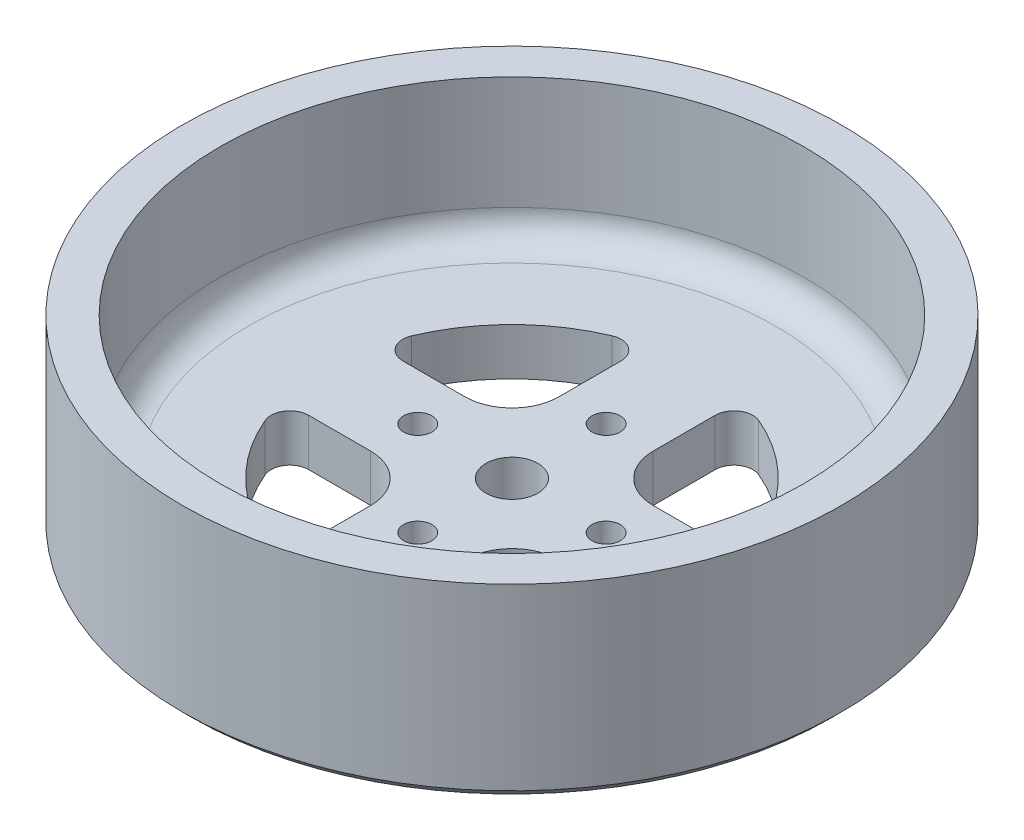
ISO-10303-21;
HEADER;
FILE_DESCRIPTION(('STEP AP214'),'2;1');
FILE_NAME('part.step','',(''),(''),'','','');
FILE_SCHEMA(('AUTOMOTIVE_DESIGN { 1 0 10303 214 1 1 1 1 }'));
ENDSEC;
DATA;
#1=APPLICATION_CONTEXT('core data for automotive mechanical design processes');
#2=APPLICATION_PROTOCOL_DEFINITION('international standard','automotive_design',2000,#1);
#3=PRODUCT_CONTEXT('',#1,'mechanical');
#4=PRODUCT('Part','Part','',(#3));
#5=PRODUCT_RELATED_PRODUCT_CATEGORY('part','',(#4));
#6=PRODUCT_DEFINITION_FORMATION('','',#4);
#7=PRODUCT_DEFINITION_CONTEXT('part definition',#1,'design');
#8=PRODUCT_DEFINITION('design','',#6,#7);
#9=PRODUCT_DEFINITION_SHAPE('','',#8);
#10=(LENGTH_UNIT() NAMED_UNIT(*) SI_UNIT(.MILLI.,.METRE.));
#11=(NAMED_UNIT(*) PLANE_ANGLE_UNIT() SI_UNIT($,.RADIAN.));
#12=(NAMED_UNIT(*) SI_UNIT($,.STERADIAN.) SOLID_ANGLE_UNIT());
#13=UNCERTAINTY_MEASURE_WITH_UNIT(LENGTH_MEASURE(1.E-05),#10,'distance_accuracy_value','');
#14=(GEOMETRIC_REPRESENTATION_CONTEXT(3) GLOBAL_UNCERTAINTY_ASSIGNED_CONTEXT((#13)) GLOBAL_UNIT_ASSIGNED_CONTEXT((#10,
#11,#12)) REPRESENTATION_CONTEXT('',''));
#15=CARTESIAN_POINT('',(0.,0.,0.));
#16=DIRECTION('',(0.,0.,1.));
#17=DIRECTION('',(1.,0.,0.));
#18=AXIS2_PLACEMENT_3D('',#15,#16,#17);
#19=CARTESIAN_POINT('',(0.,5.,0.));
#20=DIRECTION('',(0.,-1.,0.));
#21=DIRECTION('',(0.,0.,-1.));
#22=AXIS2_PLACEMENT_3D('',#19,#20,#21);
#23=CYLINDRICAL_SURFACE('',#22,20.);
#24=CARTESIAN_POINT('',(0.,0.,0.));
#25=DIRECTION('',(0.,1.,0.));
#26=DIRECTION('',(0.,0.,1.));
#27=AXIS2_PLACEMENT_3D('',#24,#25,#26);
#28=CIRCLE('',#27,20.);
#29=CARTESIAN_POINT('',(-7.77777777777778,0.,-18.4256932797522));
#30=VERTEX_POINT('',#29);
#31=CARTESIAN_POINT('',(-18.4256932797522,0.,-7.77777777777778));
#32=VERTEX_POINT('',#31);
#33=EDGE_CURVE('E575',#30,#32,#28,.T.);
#34=ORIENTED_EDGE('',*,*,#33,.F.);
#35=DIRECTION('',(0.,-1.,0.));
#36=VECTOR('',#35,1.);
#37=CARTESIAN_POINT('',(-7.77777777777778,5.,-18.4256932797522));
#38=LINE('',#37,#36);
#39=CARTESIAN_POINT('',(-7.77777777777778,5.,-18.4256932797522));
#40=VERTEX_POINT('',#39);
#41=EDGE_CURVE('E339',#30,#40,#38,.F.);
#42=ORIENTED_EDGE('',*,*,#41,.T.);
#43=CARTESIAN_POINT('',(0.,5.,0.));
#44=DIRECTION('',(0.,1.,0.));
#45=DIRECTION('',(0.,0.,1.));
#46=AXIS2_PLACEMENT_3D('',#43,#44,#45);
#47=CIRCLE('',#46,20.);
#48=CARTESIAN_POINT('',(-18.4256932797522,5.,-7.77777777777778));
#49=VERTEX_POINT('',#48);
#50=EDGE_CURVE('E515',#40,#49,#47,.T.);
#51=ORIENTED_EDGE('',*,*,#50,.T.);
#52=DIRECTION('',(0.,-1.,0.));
#53=VECTOR('',#52,1.);
#54=CARTESIAN_POINT('',(-18.4256932797522,5.,-7.77777777777778));
#55=LINE('',#54,#53);
#56=EDGE_CURVE('E335',#49,#32,#55,.T.);
#57=ORIENTED_EDGE('',*,*,#56,.T.);
#58=EDGE_LOOP('',(#34,#42,#51,#57));
#59=FACE_BOUND('',#58,.T.);
#60=ADVANCED_FACE('F41',(#59),#23,.F.);
#61=CARTESIAN_POINT('',(-5.,5.,0.));
#62=DIRECTION('',(-1.,0.,0.));
#63=DIRECTION('',(0.,0.,1.));
#64=AXIS2_PLACEMENT_3D('',#61,#62,#63);
#65=PLANE('',#64);
#66=DIRECTION('',(0.,0.,-1.));
#67=VECTOR('',#66,1.);
#68=CARTESIAN_POINT('',(-5.,5.,0.));
#69=LINE('',#68,#67);
#70=CARTESIAN_POINT('',(-5.,5.,-10.));
#71=VERTEX_POINT('',#70);
#72=CARTESIAN_POINT('',(-5.,5.,-16.583123951777));
#73=VERTEX_POINT('',#72);
#74=EDGE_CURVE('E520',#71,#73,#69,.T.);
#75=ORIENTED_EDGE('',*,*,#74,.T.);
#76=DIRECTION('',(0.,1.,0.));
#77=VECTOR('',#76,1.);
#78=CARTESIAN_POINT('',(-5.,0.,-16.583123951777));
#79=LINE('',#78,#77);
#80=CARTESIAN_POINT('',(-5.,0.,-16.583123951777));
#81=VERTEX_POINT('',#80);
#82=EDGE_CURVE('E331',#73,#81,#79,.F.);
#83=ORIENTED_EDGE('',*,*,#82,.T.);
#84=DIRECTION('',(0.,0.,-1.));
#85=VECTOR('',#84,1.);
#86=CARTESIAN_POINT('',(-5.,0.,0.));
#87=LINE('',#86,#85);
#88=CARTESIAN_POINT('',(-5.,0.,-10.));
#89=VERTEX_POINT('',#88);
#90=EDGE_CURVE('E578',#89,#81,#87,.T.);
#91=ORIENTED_EDGE('',*,*,#90,.F.);
#92=DIRECTION('',(0.,-1.,0.));
#93=VECTOR('',#92,1.);
#94=CARTESIAN_POINT('',(-5.,5.,-10.));
#95=LINE('',#94,#93);
#96=EDGE_CURVE('E227',#89,#71,#95,.F.);
#97=ORIENTED_EDGE('',*,*,#96,.T.);
#98=EDGE_LOOP('',(#75,#83,#91,#97));
#99=FACE_BOUND('',#98,.T.);
#100=ADVANCED_FACE('F414',(#99),#65,.T.);
#101=CARTESIAN_POINT('',(0.,5.,0.));
#102=DIRECTION('',(0.,-1.,0.));
#103=DIRECTION('',(0.,0.,-1.));
#104=AXIS2_PLACEMENT_3D('',#101,#102,#103);
#105=CYLINDRICAL_SURFACE('',#104,20.);
#106=CARTESIAN_POINT('',(0.,0.,0.));
#107=DIRECTION('',(0.,1.,0.));
#108=DIRECTION('',(0.,0.,1.));
#109=AXIS2_PLACEMENT_3D('',#106,#107,#108);
#110=CIRCLE('',#109,20.);
#111=CARTESIAN_POINT('',(18.4256932797522,0.,-7.77777777777778));
#112=VERTEX_POINT('',#111);
#113=CARTESIAN_POINT('',(7.77777777777778,0.,-18.4256932797522));
#114=VERTEX_POINT('',#113);
#115=EDGE_CURVE('E215',#112,#114,#110,.T.);
#116=ORIENTED_EDGE('',*,*,#115,.F.);
#117=DIRECTION('',(0.,-1.,0.));
#118=VECTOR('',#117,1.);
#119=CARTESIAN_POINT('',(18.4256932797522,5.,-7.77777777777778));
#120=LINE('',#119,#118);
#121=CARTESIAN_POINT('',(18.4256932797522,5.,-7.77777777777778));
#122=VERTEX_POINT('',#121);
#123=EDGE_CURVE('E311',#112,#122,#120,.F.);
#124=ORIENTED_EDGE('',*,*,#123,.T.);
#125=CARTESIAN_POINT('',(0.,5.,0.));
#126=DIRECTION('',(0.,1.,0.));
#127=DIRECTION('',(0.,0.,1.));
#128=AXIS2_PLACEMENT_3D('',#125,#126,#127);
#129=CIRCLE('',#128,20.);
#130=CARTESIAN_POINT('',(7.77777777777778,5.,-18.4256932797522));
#131=VERTEX_POINT('',#130);
#132=EDGE_CURVE('E631',#122,#131,#129,.T.);
#133=ORIENTED_EDGE('',*,*,#132,.T.);
#134=DIRECTION('',(0.,-1.,0.));
#135=VECTOR('',#134,1.);
#136=CARTESIAN_POINT('',(7.77777777777778,5.,-18.4256932797522));
#137=LINE('',#136,#135);
#138=EDGE_CURVE('E307',#131,#114,#137,.T.);
#139=ORIENTED_EDGE('',*,*,#138,.T.);
#140=EDGE_LOOP('',(#116,#124,#133,#139));
#141=FACE_BOUND('',#140,.T.);
#142=ADVANCED_FACE('F420',(#141),#105,.F.);
#143=CARTESIAN_POINT('',(0.,5.,-5.));
#144=DIRECTION('',(0.,0.,-1.));
#145=DIRECTION('',(-1.,0.,0.));
#146=AXIS2_PLACEMENT_3D('',#143,#144,#145);
#147=PLANE('',#146);
#148=DIRECTION('',(1.,0.,0.));
#149=VECTOR('',#148,1.);
#150=CARTESIAN_POINT('',(0.,5.,-5.));
#151=LINE('',#150,#149);
#152=CARTESIAN_POINT('',(10.,5.,-5.));
#153=VERTEX_POINT('',#152);
#154=CARTESIAN_POINT('',(16.583123951777,5.,-5.));
#155=VERTEX_POINT('',#154);
#156=EDGE_CURVE('E527',#153,#155,#151,.T.);
#157=ORIENTED_EDGE('',*,*,#156,.T.);
#158=DIRECTION('',(0.,1.,0.));
#159=VECTOR('',#158,1.);
#160=CARTESIAN_POINT('',(16.583123951777,0.,-5.));
#161=LINE('',#160,#159);
#162=CARTESIAN_POINT('',(16.583123951777,0.,-5.));
#163=VERTEX_POINT('',#162);
#164=EDGE_CURVE('E303',#155,#163,#161,.F.);
#165=ORIENTED_EDGE('',*,*,#164,.T.);
#166=DIRECTION('',(1.,0.,0.));
#167=VECTOR('',#166,1.);
#168=CARTESIAN_POINT('',(0.,0.,-5.));
#169=LINE('',#168,#167);
#170=CARTESIAN_POINT('',(10.,0.,-5.));
#171=VERTEX_POINT('',#170);
#172=EDGE_CURVE('E568',#171,#163,#169,.T.);
#173=ORIENTED_EDGE('',*,*,#172,.F.);
#174=DIRECTION('',(0.,-1.,0.));
#175=VECTOR('',#174,1.);
#176=CARTESIAN_POINT('',(10.,5.,-5.));
#177=LINE('',#176,#175);
#178=EDGE_CURVE('E257',#171,#153,#177,.F.);
#179=ORIENTED_EDGE('',*,*,#178,.T.);
#180=EDGE_LOOP('',(#157,#165,#173,#179));
#181=FACE_BOUND('',#180,.T.);
#182=ADVANCED_FACE('F431',(#181),#147,.T.);
#183=CARTESIAN_POINT('',(0.,5.,0.));
#184=DIRECTION('',(0.,-1.,0.));
#185=DIRECTION('',(0.,0.,-1.));
#186=AXIS2_PLACEMENT_3D('',#183,#184,#185);
#187=CYLINDRICAL_SURFACE('',#186,20.);
#188=CARTESIAN_POINT('',(0.,5.,0.));
#189=DIRECTION('',(0.,1.,0.));
#190=DIRECTION('',(0.,0.,1.));
#191=AXIS2_PLACEMENT_3D('',#188,#189,#190);
#192=CIRCLE('',#191,20.);
#193=CARTESIAN_POINT('',(-18.4256932797522,5.,7.77777777777778));
#194=VERTEX_POINT('',#193);
#195=CARTESIAN_POINT('',(-7.77777777777777,5.,18.4256932797522));
#196=VERTEX_POINT('',#195);
#197=EDGE_CURVE('E621',#194,#196,#192,.T.);
#198=ORIENTED_EDGE('',*,*,#197,.T.);
#199=DIRECTION('',(0.,-1.,0.));
#200=VECTOR('',#199,1.);
#201=CARTESIAN_POINT('',(-7.77777777777777,5.,18.4256932797522));
#202=LINE('',#201,#200);
#203=CARTESIAN_POINT('',(-7.77777777777777,0.,18.4256932797522));
#204=VERTEX_POINT('',#203);
#205=EDGE_CURVE('E320',#196,#204,#202,.T.);
#206=ORIENTED_EDGE('',*,*,#205,.T.);
#207=CARTESIAN_POINT('',(0.,0.,0.));
#208=DIRECTION('',(0.,1.,0.));
#209=DIRECTION('',(0.,0.,1.));
#210=AXIS2_PLACEMENT_3D('',#207,#208,#209);
#211=CIRCLE('',#210,20.);
#212=CARTESIAN_POINT('',(-18.4256932797522,0.,7.77777777777778));
#213=VERTEX_POINT('',#212);
#214=EDGE_CURVE('E560',#213,#204,#211,.T.);
#215=ORIENTED_EDGE('',*,*,#214,.F.);
#216=DIRECTION('',(0.,-1.,0.));
#217=VECTOR('',#216,1.);
#218=CARTESIAN_POINT('',(-18.4256932797522,5.,7.77777777777778));
#219=LINE('',#218,#217);
#220=EDGE_CURVE('E317',#213,#194,#219,.F.);
#221=ORIENTED_EDGE('',*,*,#220,.T.);
#222=EDGE_LOOP('',(#198,#206,#215,#221));
#223=FACE_BOUND('',#222,.T.);
#224=ADVANCED_FACE('F434',(#223),#187,.F.);
#225=CARTESIAN_POINT('',(0.,5.,5.));
#226=DIRECTION('',(0.,0.,1.));
#227=DIRECTION('',(1.,0.,0.));
#228=AXIS2_PLACEMENT_3D('',#225,#226,#227);
#229=PLANE('',#228);
#230=DIRECTION('',(-1.,0.,0.));
#231=VECTOR('',#230,1.);
#232=CARTESIAN_POINT('',(0.,5.,5.));
#233=LINE('',#232,#231);
#234=CARTESIAN_POINT('',(-9.99999999999999,5.,5.));
#235=VERTEX_POINT('',#234);
#236=CARTESIAN_POINT('',(-16.583123951777,5.,5.));
#237=VERTEX_POINT('',#236);
#238=EDGE_CURVE('E625',#235,#237,#233,.T.);
#239=ORIENTED_EDGE('',*,*,#238,.T.);
#240=DIRECTION('',(0.,1.,0.));
#241=VECTOR('',#240,1.);
#242=CARTESIAN_POINT('',(-16.583123951777,0.,5.));
#243=LINE('',#242,#241);
#244=CARTESIAN_POINT('',(-16.583123951777,0.,5.));
#245=VERTEX_POINT('',#244);
#246=EDGE_CURVE('E327',#237,#245,#243,.F.);
#247=ORIENTED_EDGE('',*,*,#246,.T.);
#248=DIRECTION('',(-1.,0.,0.));
#249=VECTOR('',#248,1.);
#250=CARTESIAN_POINT('',(0.,0.,5.));
#251=LINE('',#250,#249);
#252=CARTESIAN_POINT('',(-9.99999999999999,0.,5.));
#253=VERTEX_POINT('',#252);
#254=EDGE_CURVE('E216',#253,#245,#251,.T.);
#255=ORIENTED_EDGE('',*,*,#254,.F.);
#256=DIRECTION('',(0.,-1.,0.));
#257=VECTOR('',#256,1.);
#258=CARTESIAN_POINT('',(-9.99999999999999,5.,5.));
#259=LINE('',#258,#257);
#260=EDGE_CURVE('E224',#253,#235,#259,.F.);
#261=ORIENTED_EDGE('',*,*,#260,.T.);
#262=EDGE_LOOP('',(#239,#247,#255,#261));
#263=FACE_BOUND('',#262,.T.);
#264=ADVANCED_FACE('F442',(#263),#229,.T.);
#265=CARTESIAN_POINT('',(0.,5.,0.));
#266=DIRECTION('',(0.,-1.,0.));
#267=DIRECTION('',(0.,0.,-1.));
#268=AXIS2_PLACEMENT_3D('',#265,#266,#267);
#269=CYLINDRICAL_SURFACE('',#268,20.);
#270=CARTESIAN_POINT('',(0.,0.,0.));
#271=DIRECTION('',(0.,1.,0.));
#272=DIRECTION('',(0.,0.,1.));
#273=AXIS2_PLACEMENT_3D('',#270,#271,#272);
#274=CIRCLE('',#273,20.);
#275=CARTESIAN_POINT('',(7.77777777777778,0.,18.4256932797522));
#276=VERTEX_POINT('',#275);
#277=CARTESIAN_POINT('',(18.4256932797522,0.,7.77777777777777));
#278=VERTEX_POINT('',#277);
#279=EDGE_CURVE('E548',#276,#278,#274,.T.);
#280=ORIENTED_EDGE('',*,*,#279,.F.);
#281=DIRECTION('',(0.,-1.,0.));
#282=VECTOR('',#281,1.);
#283=CARTESIAN_POINT('',(7.77777777777778,5.,18.4256932797522));
#284=LINE('',#283,#282);
#285=CARTESIAN_POINT('',(7.77777777777778,5.,18.4256932797522));
#286=VERTEX_POINT('',#285);
#287=EDGE_CURVE('E297',#276,#286,#284,.F.);
#288=ORIENTED_EDGE('',*,*,#287,.T.);
#289=CARTESIAN_POINT('',(0.,5.,0.));
#290=DIRECTION('',(0.,1.,0.));
#291=DIRECTION('',(0.,0.,1.));
#292=AXIS2_PLACEMENT_3D('',#289,#290,#291);
#293=CIRCLE('',#292,20.);
#294=CARTESIAN_POINT('',(18.4256932797522,5.,7.77777777777777));
#295=VERTEX_POINT('',#294);
#296=EDGE_CURVE('E603',#286,#295,#293,.T.);
#297=ORIENTED_EDGE('',*,*,#296,.T.);
#298=DIRECTION('',(0.,-1.,0.));
#299=VECTOR('',#298,1.);
#300=CARTESIAN_POINT('',(18.4256932797522,5.,7.77777777777777));
#301=LINE('',#300,#299);
#302=EDGE_CURVE('E293',#295,#278,#301,.T.);
#303=ORIENTED_EDGE('',*,*,#302,.T.);
#304=EDGE_LOOP('',(#280,#288,#297,#303));
#305=FACE_BOUND('',#304,.T.);
#306=ADVANCED_FACE('F445',(#305),#269,.F.);
#307=CARTESIAN_POINT('',(5.,5.,0.));
#308=DIRECTION('',(1.,0.,0.));
#309=DIRECTION('',(0.,0.,-1.));
#310=AXIS2_PLACEMENT_3D('',#307,#308,#309);
#311=PLANE('',#310);
#312=DIRECTION('',(0.,0.,1.));
#313=VECTOR('',#312,1.);
#314=CARTESIAN_POINT('',(5.,5.,0.));
#315=LINE('',#314,#313);
#316=CARTESIAN_POINT('',(5.,5.,9.99999999999999));
#317=VERTEX_POINT('',#316);
#318=CARTESIAN_POINT('',(5.,5.,16.583123951777));
#319=VERTEX_POINT('',#318);
#320=EDGE_CURVE('E608',#317,#319,#315,.T.);
#321=ORIENTED_EDGE('',*,*,#320,.T.);
#322=DIRECTION('',(0.,1.,0.));
#323=VECTOR('',#322,1.);
#324=CARTESIAN_POINT('',(5.,0.,16.583123951777));
#325=LINE('',#324,#323);
#326=CARTESIAN_POINT('',(5.,0.,16.583123951777));
#327=VERTEX_POINT('',#326);
#328=EDGE_CURVE('E289',#319,#327,#325,.F.);
#329=ORIENTED_EDGE('',*,*,#328,.T.);
#330=DIRECTION('',(0.,0.,1.));
#331=VECTOR('',#330,1.);
#332=CARTESIAN_POINT('',(5.,0.,0.));
#333=LINE('',#332,#331);
#334=CARTESIAN_POINT('',(5.,0.,9.99999999999999));
#335=VERTEX_POINT('',#334);
#336=EDGE_CURVE('E552',#335,#327,#333,.T.);
#337=ORIENTED_EDGE('',*,*,#336,.F.);
#338=DIRECTION('',(0.,-1.,0.));
#339=VECTOR('',#338,1.);
#340=CARTESIAN_POINT('',(5.,5.,9.99999999999999));
#341=LINE('',#340,#339);
#342=EDGE_CURVE('E250',#335,#317,#341,.F.);
#343=ORIENTED_EDGE('',*,*,#342,.T.);
#344=EDGE_LOOP('',(#321,#329,#337,#343));
#345=FACE_BOUND('',#344,.T.);
#346=ADVANCED_FACE('F454',(#345),#311,.T.);
#347=CARTESIAN_POINT('',(0.,5.,0.));
#348=DIRECTION('',(0.,-1.,0.));
#349=DIRECTION('',(0.,0.,-1.));
#350=AXIS2_PLACEMENT_3D('',#347,#348,#349);
#351=CYLINDRICAL_SURFACE('',#350,2.75);
#352=CARTESIAN_POINT('',(0.,5.,0.));
#353=DIRECTION('',(0.,1.,0.));
#354=DIRECTION('',(0.,0.,1.));
#355=AXIS2_PLACEMENT_3D('',#352,#353,#354);
#356=CIRCLE('',#355,2.75);
#357=CARTESIAN_POINT('',(0.,5.,2.75));
#358=VERTEX_POINT('',#357);
#359=EDGE_CURVE('E234',#358,#358,#356,.T.);
#360=ORIENTED_EDGE('',*,*,#359,.T.);
#361=EDGE_LOOP('',(#360));
#362=FACE_BOUND('',#361,.T.);
#363=CARTESIAN_POINT('',(0.,0.,0.));
#364=DIRECTION('',(0.,1.,0.));
#365=DIRECTION('',(0.,0.,1.));
#366=AXIS2_PLACEMENT_3D('',#363,#364,#365);
#367=CIRCLE('',#366,2.75);
#368=CARTESIAN_POINT('',(0.,0.,2.75));
#369=VERTEX_POINT('',#368);
#370=EDGE_CURVE('E244',#369,#369,#367,.T.);
#371=ORIENTED_EDGE('',*,*,#370,.F.);
#372=EDGE_LOOP('',(#371));
#373=FACE_BOUND('',#372,.T.);
#374=ADVANCED_FACE('F457',(#362,#373),#351,.F.);
#375=CARTESIAN_POINT('',(-10.,5.,0.));
#376=DIRECTION('',(0.,-1.,0.));
#377=DIRECTION('',(0.,0.,-1.));
#378=AXIS2_PLACEMENT_3D('',#375,#376,#377);
#379=CYLINDRICAL_SURFACE('',#378,1.5);
#380=CARTESIAN_POINT('',(-10.,5.,0.));
#381=DIRECTION('',(0.,1.,0.));
#382=DIRECTION('',(0.,0.,1.));
#383=AXIS2_PLACEMENT_3D('',#380,#381,#382);
#384=CIRCLE('',#383,1.5);
#385=CARTESIAN_POINT('',(-10.,5.,1.5));
#386=VERTEX_POINT('',#385);
#387=EDGE_CURVE('E241',#386,#386,#384,.T.);
#388=ORIENTED_EDGE('',*,*,#387,.T.);
#389=EDGE_LOOP('',(#388));
#390=FACE_BOUND('',#389,.T.);
#391=CARTESIAN_POINT('',(-10.,0.,0.));
#392=DIRECTION('',(0.,1.,0.));
#393=DIRECTION('',(0.,0.,1.));
#394=AXIS2_PLACEMENT_3D('',#391,#392,#393);
#395=CIRCLE('',#394,1.5);
#396=CARTESIAN_POINT('',(-10.,0.,1.5));
#397=VERTEX_POINT('',#396);
#398=EDGE_CURVE('E596',#397,#397,#395,.T.);
#399=ORIENTED_EDGE('',*,*,#398,.F.);
#400=EDGE_LOOP('',(#399));
#401=FACE_BOUND('',#400,.T.);
#402=ADVANCED_FACE('F667',(#390,#401),#379,.F.);
#403=CARTESIAN_POINT('',(0.,5.,-10.));
#404=DIRECTION('',(0.,-1.,0.));
#405=DIRECTION('',(0.,0.,-1.));
#406=AXIS2_PLACEMENT_3D('',#403,#404,#405);
#407=CYLINDRICAL_SURFACE('',#406,1.5);
#408=CARTESIAN_POINT('',(0.,5.,-10.));
#409=DIRECTION('',(0.,1.,0.));
#410=DIRECTION('',(0.,0.,1.));
#411=AXIS2_PLACEMENT_3D('',#408,#409,#410);
#412=CIRCLE('',#411,1.5);
#413=CARTESIAN_POINT('',(0.,5.,-8.5));
#414=VERTEX_POINT('',#413);
#415=EDGE_CURVE('E541',#414,#414,#412,.T.);
#416=ORIENTED_EDGE('',*,*,#415,.T.);
#417=EDGE_LOOP('',(#416));
#418=FACE_BOUND('',#417,.T.);
#419=CARTESIAN_POINT('',(0.,0.,-10.));
#420=DIRECTION('',(0.,1.,0.));
#421=DIRECTION('',(0.,0.,1.));
#422=AXIS2_PLACEMENT_3D('',#419,#420,#421);
#423=CIRCLE('',#422,1.5);
#424=CARTESIAN_POINT('',(0.,0.,-8.5));
#425=VERTEX_POINT('',#424);
#426=EDGE_CURVE('E593',#425,#425,#423,.T.);
#427=ORIENTED_EDGE('',*,*,#426,.F.);
#428=EDGE_LOOP('',(#427));
#429=FACE_BOUND('',#428,.T.);
#430=ADVANCED_FACE('F671',(#418,#429),#407,.F.);
#431=CARTESIAN_POINT('',(10.,5.,0.));
#432=DIRECTION('',(0.,-1.,0.));
#433=DIRECTION('',(0.,0.,-1.));
#434=AXIS2_PLACEMENT_3D('',#431,#432,#433);
#435=CYLINDRICAL_SURFACE('',#434,1.5);
#436=CARTESIAN_POINT('',(10.,5.,0.));
#437=DIRECTION('',(0.,1.,0.));
#438=DIRECTION('',(0.,0.,1.));
#439=AXIS2_PLACEMENT_3D('',#436,#437,#438);
#440=CIRCLE('',#439,1.5);
#441=CARTESIAN_POINT('',(10.,5.,1.5));
#442=VERTEX_POINT('',#441);
#443=EDGE_CURVE('E537',#442,#442,#440,.T.);
#444=ORIENTED_EDGE('',*,*,#443,.T.);
#445=EDGE_LOOP('',(#444));
#446=FACE_BOUND('',#445,.T.);
#447=CARTESIAN_POINT('',(10.,0.,0.));
#448=DIRECTION('',(0.,1.,0.));
#449=DIRECTION('',(0.,0.,1.));
#450=AXIS2_PLACEMENT_3D('',#447,#448,#449);
#451=CIRCLE('',#450,1.5);
#452=CARTESIAN_POINT('',(10.,0.,1.5));
#453=VERTEX_POINT('',#452);
#454=EDGE_CURVE('E589',#453,#453,#451,.T.);
#455=ORIENTED_EDGE('',*,*,#454,.F.);
#456=EDGE_LOOP('',(#455));
#457=FACE_BOUND('',#456,.T.);
#458=ADVANCED_FACE('F675',(#446,#457),#435,.F.);
#459=CARTESIAN_POINT('',(0.,5.,10.));
#460=DIRECTION('',(0.,-1.,0.));
#461=DIRECTION('',(0.,0.,-1.));
#462=AXIS2_PLACEMENT_3D('',#459,#460,#461);
#463=CYLINDRICAL_SURFACE('',#462,1.5);
#464=CARTESIAN_POINT('',(0.,5.,10.));
#465=DIRECTION('',(0.,1.,0.));
#466=DIRECTION('',(0.,0.,1.));
#467=AXIS2_PLACEMENT_3D('',#464,#465,#466);
#468=CIRCLE('',#467,1.5);
#469=CARTESIAN_POINT('',(0.,5.,11.5));
#470=VERTEX_POINT('',#469);
#471=EDGE_CURVE('E533',#470,#470,#468,.T.);
#472=ORIENTED_EDGE('',*,*,#471,.T.);
#473=EDGE_LOOP('',(#472));
#474=FACE_BOUND('',#473,.T.);
#475=CARTESIAN_POINT('',(0.,0.,10.));
#476=DIRECTION('',(0.,1.,0.));
#477=DIRECTION('',(0.,0.,1.));
#478=AXIS2_PLACEMENT_3D('',#475,#476,#477);
#479=CIRCLE('',#478,1.5);
#480=CARTESIAN_POINT('',(0.,0.,11.5));
#481=VERTEX_POINT('',#480);
#482=EDGE_CURVE('E585',#481,#481,#479,.T.);
#483=ORIENTED_EDGE('',*,*,#482,.F.);
#484=EDGE_LOOP('',(#483));
#485=FACE_BOUND('',#484,.T.);
#486=ADVANCED_FACE('F679',(#474,#485),#463,.F.);
#487=CARTESIAN_POINT('',(0.,5.,-5.));
#488=DIRECTION('',(0.,0.,-1.));
#489=DIRECTION('',(-1.,0.,0.));
#490=AXIS2_PLACEMENT_3D('',#487,#488,#489);
#491=PLANE('',#490);
#492=DIRECTION('',(1.,0.,0.));
#493=VECTOR('',#492,1.);
#494=CARTESIAN_POINT('',(0.,0.,-5.));
#495=LINE('',#494,#493);
#496=CARTESIAN_POINT('',(-16.583123951777,0.,-5.));
#497=VERTEX_POINT('',#496);
#498=CARTESIAN_POINT('',(-10.,0.,-5.));
#499=VERTEX_POINT('',#498);
#500=EDGE_CURVE('E582',#497,#499,#495,.T.);
#501=ORIENTED_EDGE('',*,*,#500,.F.);
#502=DIRECTION('',(0.,1.,0.));
#503=VECTOR('',#502,1.);
#504=CARTESIAN_POINT('',(-16.583123951777,5.,-5.));
#505=LINE('',#504,#503);
#506=CARTESIAN_POINT('',(-16.583123951777,5.,-5.));
#507=VERTEX_POINT('',#506);
#508=EDGE_CURVE('E64',#497,#507,#505,.T.);
#509=ORIENTED_EDGE('',*,*,#508,.T.);
#510=DIRECTION('',(1.,0.,0.));
#511=VECTOR('',#510,1.);
#512=CARTESIAN_POINT('',(0.,5.,-5.));
#513=LINE('',#512,#511);
#514=CARTESIAN_POINT('',(-10.,5.,-5.));
#515=VERTEX_POINT('',#514);
#516=EDGE_CURVE('E517',#507,#515,#513,.T.);
#517=ORIENTED_EDGE('',*,*,#516,.T.);
#518=DIRECTION('',(0.,-1.,0.));
#519=VECTOR('',#518,1.);
#520=CARTESIAN_POINT('',(-10.,0.,-5.));
#521=LINE('',#520,#519);
#522=EDGE_CURVE('E260',#515,#499,#521,.T.);
#523=ORIENTED_EDGE('',*,*,#522,.T.);
#524=EDGE_LOOP('',(#501,#509,#517,#523));
#525=FACE_BOUND('',#524,.T.);
#526=ADVANCED_FACE('F429',(#525),#491,.T.);
#527=CARTESIAN_POINT('',(5.,5.,0.));
#528=DIRECTION('',(1.,0.,0.));
#529=DIRECTION('',(0.,0.,-1.));
#530=AXIS2_PLACEMENT_3D('',#527,#528,#529);
#531=PLANE('',#530);
#532=DIRECTION('',(0.,0.,1.));
#533=VECTOR('',#532,1.);
#534=CARTESIAN_POINT('',(5.,0.,0.));
#535=LINE('',#534,#533);
#536=CARTESIAN_POINT('',(5.,0.,-16.583123951777));
#537=VERTEX_POINT('',#536);
#538=CARTESIAN_POINT('',(5.,0.,-10.));
#539=VERTEX_POINT('',#538);
#540=EDGE_CURVE('E572',#537,#539,#535,.T.);
#541=ORIENTED_EDGE('',*,*,#540,.F.);
#542=DIRECTION('',(0.,1.,0.));
#543=VECTOR('',#542,1.);
#544=CARTESIAN_POINT('',(5.,5.,-16.583123951777));
#545=LINE('',#544,#543);
#546=CARTESIAN_POINT('',(5.,5.,-16.583123951777));
#547=VERTEX_POINT('',#546);
#548=EDGE_CURVE('E314',#537,#547,#545,.T.);
#549=ORIENTED_EDGE('',*,*,#548,.T.);
#550=DIRECTION('',(0.,0.,1.));
#551=VECTOR('',#550,1.);
#552=CARTESIAN_POINT('',(5.,5.,0.));
#553=LINE('',#552,#551);
#554=CARTESIAN_POINT('',(5.,5.,-10.));
#555=VERTEX_POINT('',#554);
#556=EDGE_CURVE('E521',#547,#555,#553,.T.);
#557=ORIENTED_EDGE('',*,*,#556,.T.);
#558=DIRECTION('',(0.,-1.,0.));
#559=VECTOR('',#558,1.);
#560=CARTESIAN_POINT('',(5.,0.,-10.));
#561=LINE('',#560,#559);
#562=EDGE_CURVE('E253',#555,#539,#561,.T.);
#563=ORIENTED_EDGE('',*,*,#562,.T.);
#564=EDGE_LOOP('',(#541,#549,#557,#563));
#565=FACE_BOUND('',#564,.T.);
#566=ADVANCED_FACE('F426',(#565),#531,.T.);
#567=CARTESIAN_POINT('',(-5.,5.,0.));
#568=DIRECTION('',(-1.,0.,0.));
#569=DIRECTION('',(0.,0.,1.));
#570=AXIS2_PLACEMENT_3D('',#567,#568,#569);
#571=PLANE('',#570);
#572=DIRECTION('',(0.,0.,-1.));
#573=VECTOR('',#572,1.);
#574=CARTESIAN_POINT('',(-5.,0.,0.));
#575=LINE('',#574,#573);
#576=CARTESIAN_POINT('',(-4.99999999999999,0.,16.583123951777));
#577=VERTEX_POINT('',#576);
#578=CARTESIAN_POINT('',(-5.,0.,10.));
#579=VERTEX_POINT('',#578);
#580=EDGE_CURVE('E202',#577,#579,#575,.T.);
#581=ORIENTED_EDGE('',*,*,#580,.F.);
#582=DIRECTION('',(0.,1.,0.));
#583=VECTOR('',#582,1.);
#584=CARTESIAN_POINT('',(-4.99999999999999,5.,16.583123951777));
#585=LINE('',#584,#583);
#586=CARTESIAN_POINT('',(-4.99999999999999,5.,16.583123951777));
#587=VERTEX_POINT('',#586);
#588=EDGE_CURVE('E324',#577,#587,#585,.T.);
#589=ORIENTED_EDGE('',*,*,#588,.T.);
#590=DIRECTION('',(0.,0.,-1.));
#591=VECTOR('',#590,1.);
#592=CARTESIAN_POINT('',(-5.,5.,0.));
#593=LINE('',#592,#591);
#594=CARTESIAN_POINT('',(-5.,5.,10.));
#595=VERTEX_POINT('',#594);
#596=EDGE_CURVE('E231',#587,#595,#593,.T.);
#597=ORIENTED_EDGE('',*,*,#596,.T.);
#598=DIRECTION('',(0.,-1.,0.));
#599=VECTOR('',#598,1.);
#600=CARTESIAN_POINT('',(-5.,0.,10.));
#601=LINE('',#600,#599);
#602=EDGE_CURVE('E223',#595,#579,#601,.T.);
#603=ORIENTED_EDGE('',*,*,#602,.T.);
#604=EDGE_LOOP('',(#581,#589,#597,#603));
#605=FACE_BOUND('',#604,.T.);
#606=ADVANCED_FACE('F229',(#605),#571,.T.);
#607=CARTESIAN_POINT('',(0.,5.,5.));
#608=DIRECTION('',(0.,0.,1.));
#609=DIRECTION('',(1.,0.,0.));
#610=AXIS2_PLACEMENT_3D('',#607,#608,#609);
#611=PLANE('',#610);
#612=DIRECTION('',(-1.,0.,0.));
#613=VECTOR('',#612,1.);
#614=CARTESIAN_POINT('',(0.,0.,5.));
#615=LINE('',#614,#613);
#616=CARTESIAN_POINT('',(16.583123951777,0.,5.));
#617=VERTEX_POINT('',#616);
#618=CARTESIAN_POINT('',(10.,0.,5.));
#619=VERTEX_POINT('',#618);
#620=EDGE_CURVE('E557',#617,#619,#615,.T.);
#621=ORIENTED_EDGE('',*,*,#620,.F.);
#622=DIRECTION('',(0.,1.,0.));
#623=VECTOR('',#622,1.);
#624=CARTESIAN_POINT('',(16.583123951777,5.,5.));
#625=LINE('',#624,#623);
#626=CARTESIAN_POINT('',(16.583123951777,5.,5.));
#627=VERTEX_POINT('',#626);
#628=EDGE_CURVE('E300',#617,#627,#625,.T.);
#629=ORIENTED_EDGE('',*,*,#628,.T.);
#630=DIRECTION('',(-1.,0.,0.));
#631=VECTOR('',#630,1.);
#632=CARTESIAN_POINT('',(0.,5.,5.));
#633=LINE('',#632,#631);
#634=CARTESIAN_POINT('',(10.,5.,5.));
#635=VERTEX_POINT('',#634);
#636=EDGE_CURVE('E614',#627,#635,#633,.T.);
#637=ORIENTED_EDGE('',*,*,#636,.T.);
#638=DIRECTION('',(0.,-1.,0.));
#639=VECTOR('',#638,1.);
#640=CARTESIAN_POINT('',(10.,0.,5.));
#641=LINE('',#640,#639);
#642=EDGE_CURVE('E238',#635,#619,#641,.T.);
#643=ORIENTED_EDGE('',*,*,#642,.T.);
#644=EDGE_LOOP('',(#621,#629,#637,#643));
#645=FACE_BOUND('',#644,.T.);
#646=ADVANCED_FACE('F441',(#645),#611,.T.);
#647=CARTESIAN_POINT('',(0.,5.,0.));
#648=DIRECTION('',(0.,1.,0.));
#649=DIRECTION('',(0.,0.,1.));
#650=AXIS2_PLACEMENT_3D('',#647,#648,#649);
#651=PLANE('',#650);
#652=CARTESIAN_POINT('',(0.,5.,0.));
#653=DIRECTION('',(0.,1.,0.));
#654=DIRECTION('',(0.,0.,1.));
#655=AXIS2_PLACEMENT_3D('',#652,#653,#654);
#656=CIRCLE('',#655,28.);
#657=CARTESIAN_POINT('',(0.,5.,28.));
#658=VERTEX_POINT('',#657);
#659=EDGE_CURVE('E11',#658,#658,#656,.T.);
#660=ORIENTED_EDGE('',*,*,#659,.T.);
#661=EDGE_LOOP('',(#660));
#662=FACE_BOUND('',#661,.T.);
#663=ORIENTED_EDGE('',*,*,#296,.F.);
#664=CARTESIAN_POINT('',(7.,5.,16.583123951777));
#665=DIRECTION('',(0.,1.,0.));
#666=DIRECTION('',(0.,0.,1.));
#667=AXIS2_PLACEMENT_3D('',#664,#665,#666);
#668=CIRCLE('',#667,2.);
#669=EDGE_CURVE('E347',#286,#319,#668,.F.);
#670=ORIENTED_EDGE('',*,*,#669,.T.);
#671=ORIENTED_EDGE('',*,*,#320,.F.);
#672=CARTESIAN_POINT('',(10.,5.,9.99999999999999));
#673=DIRECTION('',(0.,1.,0.));
#674=DIRECTION('',(0.,0.,1.));
#675=AXIS2_PLACEMENT_3D('',#672,#673,#674);
#676=CIRCLE('',#675,5.);
#677=EDGE_CURVE('E271',#317,#635,#676,.F.);
#678=ORIENTED_EDGE('',*,*,#677,.T.);
#679=ORIENTED_EDGE('',*,*,#636,.F.);
#680=CARTESIAN_POINT('',(16.583123951777,5.,7.));
#681=DIRECTION('',(0.,1.,0.));
#682=DIRECTION('',(0.,0.,1.));
#683=AXIS2_PLACEMENT_3D('',#680,#681,#682);
#684=CIRCLE('',#683,2.);
#685=EDGE_CURVE('E353',#627,#295,#684,.F.);
#686=ORIENTED_EDGE('',*,*,#685,.T.);
#687=EDGE_LOOP('',(#663,#670,#671,#678,#679,#686));
#688=FACE_BOUND('',#687,.T.);
#689=ORIENTED_EDGE('',*,*,#197,.F.);
#690=CARTESIAN_POINT('',(-16.583123951777,5.,7.));
#691=DIRECTION('',(0.,1.,0.));
#692=DIRECTION('',(0.,0.,1.));
#693=AXIS2_PLACEMENT_3D('',#690,#691,#692);
#694=CIRCLE('',#693,2.);
#695=EDGE_CURVE('E376',#194,#237,#694,.F.);
#696=ORIENTED_EDGE('',*,*,#695,.T.);
#697=ORIENTED_EDGE('',*,*,#238,.F.);
#698=CARTESIAN_POINT('',(-9.99999999999999,5.,10.));
#699=DIRECTION('',(0.,1.,0.));
#700=DIRECTION('',(0.,0.,1.));
#701=AXIS2_PLACEMENT_3D('',#698,#699,#700);
#702=CIRCLE('',#701,5.);
#703=EDGE_CURVE('E226',#235,#595,#702,.F.);
#704=ORIENTED_EDGE('',*,*,#703,.T.);
#705=ORIENTED_EDGE('',*,*,#596,.F.);
#706=CARTESIAN_POINT('',(-6.99999999999999,5.,16.583123951777));
#707=DIRECTION('',(0.,1.,0.));
#708=DIRECTION('',(0.,0.,1.));
#709=AXIS2_PLACEMENT_3D('',#706,#707,#708);
#710=CIRCLE('',#709,2.);
#711=EDGE_CURVE('E370',#587,#196,#710,.F.);
#712=ORIENTED_EDGE('',*,*,#711,.T.);
#713=EDGE_LOOP('',(#689,#696,#697,#704,#705,#712));
#714=FACE_BOUND('',#713,.T.);
#715=ORIENTED_EDGE('',*,*,#132,.F.);
#716=CARTESIAN_POINT('',(16.583123951777,5.,-7.));
#717=DIRECTION('',(0.,1.,0.));
#718=DIRECTION('',(0.,0.,1.));
#719=AXIS2_PLACEMENT_3D('',#716,#717,#718);
#720=CIRCLE('',#719,2.);
#721=EDGE_CURVE('E359',#122,#155,#720,.F.);
#722=ORIENTED_EDGE('',*,*,#721,.T.);
#723=ORIENTED_EDGE('',*,*,#156,.F.);
#724=CARTESIAN_POINT('',(10.,5.,-10.));
#725=DIRECTION('',(0.,1.,0.));
#726=DIRECTION('',(0.,0.,1.));
#727=AXIS2_PLACEMENT_3D('',#724,#725,#726);
#728=CIRCLE('',#727,5.);
#729=EDGE_CURVE('E278',#153,#555,#728,.F.);
#730=ORIENTED_EDGE('',*,*,#729,.T.);
#731=ORIENTED_EDGE('',*,*,#556,.F.);
#732=CARTESIAN_POINT('',(7.,5.,-16.583123951777));
#733=DIRECTION('',(0.,1.,0.));
#734=DIRECTION('',(0.,0.,1.));
#735=AXIS2_PLACEMENT_3D('',#732,#733,#734);
#736=CIRCLE('',#735,2.);
#737=EDGE_CURVE('E365',#547,#131,#736,.F.);
#738=ORIENTED_EDGE('',*,*,#737,.T.);
#739=EDGE_LOOP('',(#715,#722,#723,#730,#731,#738));
#740=FACE_BOUND('',#739,.T.);
#741=ORIENTED_EDGE('',*,*,#50,.F.);
#742=CARTESIAN_POINT('',(-7.,5.,-16.583123951777));
#743=DIRECTION('',(0.,1.,0.));
#744=DIRECTION('',(0.,0.,1.));
#745=AXIS2_PLACEMENT_3D('',#742,#743,#744);
#746=CIRCLE('',#745,2.);
#747=EDGE_CURVE('E382',#40,#73,#746,.F.);
#748=ORIENTED_EDGE('',*,*,#747,.T.);
#749=ORIENTED_EDGE('',*,*,#74,.F.);
#750=CARTESIAN_POINT('',(-10.,5.,-10.));
#751=DIRECTION('',(0.,1.,0.));
#752=DIRECTION('',(0.,0.,1.));
#753=AXIS2_PLACEMENT_3D('',#750,#751,#752);
#754=CIRCLE('',#753,5.);
#755=EDGE_CURVE('E285',#71,#515,#754,.F.);
#756=ORIENTED_EDGE('',*,*,#755,.T.);
#757=ORIENTED_EDGE('',*,*,#516,.F.);
#758=CARTESIAN_POINT('',(-16.583123951777,5.,-7.));
#759=DIRECTION('',(0.,1.,0.));
#760=DIRECTION('',(0.,0.,1.));
#761=AXIS2_PLACEMENT_3D('',#758,#759,#760);
#762=CIRCLE('',#761,2.);
#763=EDGE_CURVE('E387',#507,#49,#762,.F.);
#764=ORIENTED_EDGE('',*,*,#763,.T.);
#765=EDGE_LOOP('',(#741,#748,#749,#756,#757,#764));
#766=FACE_BOUND('',#765,.T.);
#767=ORIENTED_EDGE('',*,*,#471,.F.);
#768=EDGE_LOOP('',(#767));
#769=FACE_BOUND('',#768,.T.);
#770=ORIENTED_EDGE('',*,*,#443,.F.);
#771=EDGE_LOOP('',(#770));
#772=FACE_BOUND('',#771,.T.);
#773=ORIENTED_EDGE('',*,*,#415,.F.);
#774=EDGE_LOOP('',(#773));
#775=FACE_BOUND('',#774,.T.);
#776=ORIENTED_EDGE('',*,*,#387,.F.);
#777=EDGE_LOOP('',(#776));
#778=FACE_BOUND('',#777,.T.);
#779=ORIENTED_EDGE('',*,*,#359,.F.);
#780=EDGE_LOOP('',(#779));
#781=FACE_BOUND('',#780,.T.);
#782=ADVANCED_FACE('F452',(#662,#688,#714,#740,#766,#769,#772,#775,#778,#781),#651,.T.);
#783=CARTESIAN_POINT('',(0.,0.,0.));
#784=DIRECTION('',(0.,1.,0.));
#785=DIRECTION('',(0.,0.,1.));
#786=AXIS2_PLACEMENT_3D('',#783,#784,#785);
#787=PLANE('',#786);
#788=CARTESIAN_POINT('',(0.,0.,0.));
#789=DIRECTION('',(0.,1.,0.));
#790=DIRECTION('',(0.,0.,1.));
#791=AXIS2_PLACEMENT_3D('',#788,#789,#790);
#792=CIRCLE('',#791,34.);
#793=CARTESIAN_POINT('',(0.,0.,34.));
#794=VERTEX_POINT('',#793);
#795=EDGE_CURVE('E394',#794,#794,#792,.F.);
#796=ORIENTED_EDGE('',*,*,#795,.T.);
#797=EDGE_LOOP('',(#796));
#798=FACE_BOUND('',#797,.T.);
#799=ORIENTED_EDGE('',*,*,#336,.T.);
#800=CARTESIAN_POINT('',(7.,0.,16.583123951777));
#801=DIRECTION('',(0.,1.,0.));
#802=DIRECTION('',(0.,0.,1.));
#803=AXIS2_PLACEMENT_3D('',#800,#801,#802);
#804=CIRCLE('',#803,2.);
#805=EDGE_CURVE('E344',#327,#276,#804,.T.);
#806=ORIENTED_EDGE('',*,*,#805,.T.);
#807=ORIENTED_EDGE('',*,*,#279,.T.);
#808=CARTESIAN_POINT('',(16.583123951777,0.,7.));
#809=DIRECTION('',(0.,1.,0.));
#810=DIRECTION('',(0.,0.,1.));
#811=AXIS2_PLACEMENT_3D('',#808,#809,#810);
#812=CIRCLE('',#811,2.);
#813=EDGE_CURVE('E350',#278,#617,#812,.T.);
#814=ORIENTED_EDGE('',*,*,#813,.T.);
#815=ORIENTED_EDGE('',*,*,#620,.T.);
#816=CARTESIAN_POINT('',(10.,0.,9.99999999999999));
#817=DIRECTION('',(0.,1.,0.));
#818=DIRECTION('',(0.,0.,1.));
#819=AXIS2_PLACEMENT_3D('',#816,#817,#818);
#820=CIRCLE('',#819,5.);
#821=EDGE_CURVE('E268',#619,#335,#820,.T.);
#822=ORIENTED_EDGE('',*,*,#821,.T.);
#823=EDGE_LOOP('',(#799,#806,#807,#814,#815,#822));
#824=FACE_BOUND('',#823,.T.);
#825=ORIENTED_EDGE('',*,*,#254,.T.);
#826=CARTESIAN_POINT('',(-16.583123951777,0.,7.));
#827=DIRECTION('',(0.,1.,0.));
#828=DIRECTION('',(0.,0.,1.));
#829=AXIS2_PLACEMENT_3D('',#826,#827,#828);
#830=CIRCLE('',#829,2.);
#831=EDGE_CURVE('E373',#245,#213,#830,.T.);
#832=ORIENTED_EDGE('',*,*,#831,.T.);
#833=ORIENTED_EDGE('',*,*,#214,.T.);
#834=CARTESIAN_POINT('',(-6.99999999999999,0.,16.583123951777));
#835=DIRECTION('',(0.,1.,0.));
#836=DIRECTION('',(0.,0.,1.));
#837=AXIS2_PLACEMENT_3D('',#834,#835,#836);
#838=CIRCLE('',#837,2.);
#839=EDGE_CURVE('E210',#204,#577,#838,.T.);
#840=ORIENTED_EDGE('',*,*,#839,.T.);
#841=ORIENTED_EDGE('',*,*,#580,.T.);
#842=CARTESIAN_POINT('',(-9.99999999999999,0.,10.));
#843=DIRECTION('',(0.,1.,0.));
#844=DIRECTION('',(0.,0.,1.));
#845=AXIS2_PLACEMENT_3D('',#842,#843,#844);
#846=CIRCLE('',#845,5.);
#847=EDGE_CURVE('E207',#579,#253,#846,.T.);
#848=ORIENTED_EDGE('',*,*,#847,.T.);
#849=EDGE_LOOP('',(#825,#832,#833,#840,#841,#848));
#850=FACE_BOUND('',#849,.T.);
#851=ORIENTED_EDGE('',*,*,#172,.T.);
#852=CARTESIAN_POINT('',(16.583123951777,0.,-7.));
#853=DIRECTION('',(0.,1.,0.));
#854=DIRECTION('',(0.,0.,1.));
#855=AXIS2_PLACEMENT_3D('',#852,#853,#854);
#856=CIRCLE('',#855,2.);
#857=EDGE_CURVE('E356',#163,#112,#856,.T.);
#858=ORIENTED_EDGE('',*,*,#857,.T.);
#859=ORIENTED_EDGE('',*,*,#115,.T.);
#860=CARTESIAN_POINT('',(7.,0.,-16.583123951777));
#861=DIRECTION('',(0.,1.,0.));
#862=DIRECTION('',(0.,0.,1.));
#863=AXIS2_PLACEMENT_3D('',#860,#861,#862);
#864=CIRCLE('',#863,2.);
#865=EDGE_CURVE('E362',#114,#537,#864,.T.);
#866=ORIENTED_EDGE('',*,*,#865,.T.);
#867=ORIENTED_EDGE('',*,*,#540,.T.);
#868=CARTESIAN_POINT('',(10.,0.,-10.));
#869=DIRECTION('',(0.,1.,0.));
#870=DIRECTION('',(0.,0.,1.));
#871=AXIS2_PLACEMENT_3D('',#868,#869,#870);
#872=CIRCLE('',#871,5.);
#873=EDGE_CURVE('E275',#539,#171,#872,.T.);
#874=ORIENTED_EDGE('',*,*,#873,.T.);
#875=EDGE_LOOP('',(#851,#858,#859,#866,#867,#874));
#876=FACE_BOUND('',#875,.T.);
#877=ORIENTED_EDGE('',*,*,#90,.T.);
#878=CARTESIAN_POINT('',(-7.,0.,-16.583123951777));
#879=DIRECTION('',(0.,1.,0.));
#880=DIRECTION('',(0.,0.,1.));
#881=AXIS2_PLACEMENT_3D('',#878,#879,#880);
#882=CIRCLE('',#881,2.);
#883=EDGE_CURVE('E379',#81,#30,#882,.T.);
#884=ORIENTED_EDGE('',*,*,#883,.T.);
#885=ORIENTED_EDGE('',*,*,#33,.T.);
#886=CARTESIAN_POINT('',(-16.583123951777,0.,-7.));
#887=DIRECTION('',(0.,1.,0.));
#888=DIRECTION('',(0.,0.,1.));
#889=AXIS2_PLACEMENT_3D('',#886,#887,#888);
#890=CIRCLE('',#889,2.);
#891=EDGE_CURVE('E57',#32,#497,#890,.T.);
#892=ORIENTED_EDGE('',*,*,#891,.T.);
#893=ORIENTED_EDGE('',*,*,#500,.T.);
#894=CARTESIAN_POINT('',(-10.,0.,-10.));
#895=DIRECTION('',(0.,1.,0.));
#896=DIRECTION('',(0.,0.,1.));
#897=AXIS2_PLACEMENT_3D('',#894,#895,#896);
#898=CIRCLE('',#897,5.);
#899=EDGE_CURVE('E282',#499,#89,#898,.T.);
#900=ORIENTED_EDGE('',*,*,#899,.T.);
#901=EDGE_LOOP('',(#877,#884,#885,#892,#893,#900));
#902=FACE_BOUND('',#901,.T.);
#903=ORIENTED_EDGE('',*,*,#482,.T.);
#904=EDGE_LOOP('',(#903));
#905=FACE_BOUND('',#904,.T.);
#906=ORIENTED_EDGE('',*,*,#454,.T.);
#907=EDGE_LOOP('',(#906));
#908=FACE_BOUND('',#907,.T.);
#909=ORIENTED_EDGE('',*,*,#426,.T.);
#910=EDGE_LOOP('',(#909));
#911=FACE_BOUND('',#910,.T.);
#912=ORIENTED_EDGE('',*,*,#398,.T.);
#913=EDGE_LOOP('',(#912));
#914=FACE_BOUND('',#913,.T.);
#915=ORIENTED_EDGE('',*,*,#370,.T.);
#916=EDGE_LOOP('',(#915));
#917=FACE_BOUND('',#916,.T.);
#918=ADVANCED_FACE('F205',(#798,#824,#850,#876,#902,#905,#908,#911,#914,#917),#787,.F.);
#919=CARTESIAN_POINT('',(0.,20.,0.));
#920=DIRECTION('',(0.,-1.,0.));
#921=DIRECTION('',(0.,0.,-1.));
#922=AXIS2_PLACEMENT_3D('',#919,#920,#921);
#923=CYLINDRICAL_SURFACE('',#922,31.);
#924=CARTESIAN_POINT('',(0.,8.,0.));
#925=DIRECTION('',(0.,1.,0.));
#926=DIRECTION('',(0.,0.,1.));
#927=AXIS2_PLACEMENT_3D('',#924,#925,#926);
#928=CIRCLE('',#927,31.);
#929=CARTESIAN_POINT('',(0.,8.,31.));
#930=VERTEX_POINT('',#929);
#931=EDGE_CURVE('E50',#930,#930,#928,.F.);
#932=ORIENTED_EDGE('',*,*,#931,.T.);
#933=EDGE_LOOP('',(#932));
#934=FACE_BOUND('',#933,.T.);
#935=CARTESIAN_POINT('',(0.,20.,0.));
#936=DIRECTION('',(0.,1.,0.));
#937=DIRECTION('',(0.,0.,1.));
#938=AXIS2_PLACEMENT_3D('',#935,#936,#937);
#939=CIRCLE('',#938,31.);
#940=CARTESIAN_POINT('',(0.,20.,31.));
#941=VERTEX_POINT('',#940);
#942=EDGE_CURVE('E921',#941,#941,#939,.T.);
#943=ORIENTED_EDGE('',*,*,#942,.T.);
#944=EDGE_LOOP('',(#943));
#945=FACE_BOUND('',#944,.T.);
#946=ADVANCED_FACE('F401',(#934,#945),#923,.F.);
#947=CARTESIAN_POINT('',(0.,20.,0.));
#948=DIRECTION('',(0.,-1.,0.));
#949=DIRECTION('',(0.,0.,-1.));
#950=AXIS2_PLACEMENT_3D('',#947,#948,#949);
#951=CYLINDRICAL_SURFACE('',#950,35.);
#952=CARTESIAN_POINT('',(0.,1.00000000000001,0.));
#953=DIRECTION('',(0.,1.,0.));
#954=DIRECTION('',(0.,0.,1.));
#955=AXIS2_PLACEMENT_3D('',#952,#953,#954);
#956=CIRCLE('',#955,35.);
#957=CARTESIAN_POINT('',(0.,1.00000000000001,35.));
#958=VERTEX_POINT('',#957);
#959=EDGE_CURVE('E390',#958,#958,#956,.T.);
#960=ORIENTED_EDGE('',*,*,#959,.T.);
#961=EDGE_LOOP('',(#960));
#962=FACE_BOUND('',#961,.T.);
#963=CARTESIAN_POINT('',(0.,20.,0.));
#964=DIRECTION('',(0.,1.,0.));
#965=DIRECTION('',(0.,0.,1.));
#966=AXIS2_PLACEMENT_3D('',#963,#964,#965);
#967=CIRCLE('',#966,35.);
#968=CARTESIAN_POINT('',(0.,20.,35.));
#969=VERTEX_POINT('',#968);
#970=EDGE_CURVE('E553',#969,#969,#967,.T.);
#971=ORIENTED_EDGE('',*,*,#970,.F.);
#972=EDGE_LOOP('',(#971));
#973=FACE_BOUND('',#972,.T.);
#974=ADVANCED_FACE('F780',(#962,#973),#951,.T.);
#975=CARTESIAN_POINT('',(0.,20.,0.));
#976=DIRECTION('',(0.,1.,0.));
#977=DIRECTION('',(0.,0.,1.));
#978=AXIS2_PLACEMENT_3D('',#975,#976,#977);
#979=PLANE('',#978);
#980=ORIENTED_EDGE('',*,*,#942,.F.);
#981=EDGE_LOOP('',(#980));
#982=FACE_BOUND('',#981,.T.);
#983=ORIENTED_EDGE('',*,*,#970,.T.);
#984=EDGE_LOOP('',(#983));
#985=FACE_BOUND('',#984,.T.);
#986=ADVANCED_FACE('F465',(#982,#985),#979,.T.);
#987=CARTESIAN_POINT('',(-9.99999999999999,5.,10.));
#988=DIRECTION('',(0.,1.,0.));
#989=DIRECTION('',(0.,0.,1.));
#990=AXIS2_PLACEMENT_3D('',#987,#988,#989);
#991=CYLINDRICAL_SURFACE('',#990,5.);
#992=ORIENTED_EDGE('',*,*,#703,.F.);
#993=ORIENTED_EDGE('',*,*,#260,.F.);
#994=ORIENTED_EDGE('',*,*,#847,.F.);
#995=ORIENTED_EDGE('',*,*,#602,.F.);
#996=EDGE_LOOP('',(#992,#993,#994,#995));
#997=FACE_BOUND('',#996,.T.);
#998=ADVANCED_FACE('F222',(#997),#991,.F.);
#999=CARTESIAN_POINT('',(10.,5.,9.99999999999999));
#1000=DIRECTION('',(0.,1.,0.));
#1001=DIRECTION('',(0.,0.,1.));
#1002=AXIS2_PLACEMENT_3D('',#999,#1000,#1001);
#1003=CYLINDRICAL_SURFACE('',#1002,5.);
#1004=ORIENTED_EDGE('',*,*,#677,.F.);
#1005=ORIENTED_EDGE('',*,*,#342,.F.);
#1006=ORIENTED_EDGE('',*,*,#821,.F.);
#1007=ORIENTED_EDGE('',*,*,#642,.F.);
#1008=EDGE_LOOP('',(#1004,#1005,#1006,#1007));
#1009=FACE_BOUND('',#1008,.T.);
#1010=ADVANCED_FACE('F464',(#1009),#1003,.F.);
#1011=CARTESIAN_POINT('',(10.,5.,-10.));
#1012=DIRECTION('',(0.,1.,0.));
#1013=DIRECTION('',(0.,0.,1.));
#1014=AXIS2_PLACEMENT_3D('',#1011,#1012,#1013);
#1015=CYLINDRICAL_SURFACE('',#1014,5.);
#1016=ORIENTED_EDGE('',*,*,#729,.F.);
#1017=ORIENTED_EDGE('',*,*,#178,.F.);
#1018=ORIENTED_EDGE('',*,*,#873,.F.);
#1019=ORIENTED_EDGE('',*,*,#562,.F.);
#1020=EDGE_LOOP('',(#1016,#1017,#1018,#1019));
#1021=FACE_BOUND('',#1020,.T.);
#1022=ADVANCED_FACE('F468',(#1021),#1015,.F.);
#1023=CARTESIAN_POINT('',(-10.,5.,-10.));
#1024=DIRECTION('',(0.,1.,0.));
#1025=DIRECTION('',(0.,0.,1.));
#1026=AXIS2_PLACEMENT_3D('',#1023,#1024,#1025);
#1027=CYLINDRICAL_SURFACE('',#1026,5.);
#1028=ORIENTED_EDGE('',*,*,#755,.F.);
#1029=ORIENTED_EDGE('',*,*,#96,.F.);
#1030=ORIENTED_EDGE('',*,*,#899,.F.);
#1031=ORIENTED_EDGE('',*,*,#522,.F.);
#1032=EDGE_LOOP('',(#1028,#1029,#1030,#1031));
#1033=FACE_BOUND('',#1032,.T.);
#1034=ADVANCED_FACE('F472',(#1033),#1027,.F.);
#1035=CARTESIAN_POINT('',(7.,5.,16.583123951777));
#1036=DIRECTION('',(0.,-1.,0.));
#1037=DIRECTION('',(0.,0.,-1.));
#1038=AXIS2_PLACEMENT_3D('',#1035,#1036,#1037);
#1039=CYLINDRICAL_SURFACE('',#1038,2.);
#1040=ORIENTED_EDGE('',*,*,#669,.F.);
#1041=ORIENTED_EDGE('',*,*,#287,.F.);
#1042=ORIENTED_EDGE('',*,*,#805,.F.);
#1043=ORIENTED_EDGE('',*,*,#328,.F.);
#1044=EDGE_LOOP('',(#1040,#1041,#1042,#1043));
#1045=FACE_BOUND('',#1044,.T.);
#1046=ADVANCED_FACE('F476',(#1045),#1039,.F.);
#1047=CARTESIAN_POINT('',(16.583123951777,5.,7.));
#1048=DIRECTION('',(0.,-1.,0.));
#1049=DIRECTION('',(0.,0.,-1.));
#1050=AXIS2_PLACEMENT_3D('',#1047,#1048,#1049);
#1051=CYLINDRICAL_SURFACE('',#1050,2.);
#1052=ORIENTED_EDGE('',*,*,#685,.F.);
#1053=ORIENTED_EDGE('',*,*,#628,.F.);
#1054=ORIENTED_EDGE('',*,*,#813,.F.);
#1055=ORIENTED_EDGE('',*,*,#302,.F.);
#1056=EDGE_LOOP('',(#1052,#1053,#1054,#1055));
#1057=FACE_BOUND('',#1056,.T.);
#1058=ADVANCED_FACE('F480',(#1057),#1051,.F.);
#1059=CARTESIAN_POINT('',(16.583123951777,5.,-7.));
#1060=DIRECTION('',(0.,-1.,0.));
#1061=DIRECTION('',(0.,0.,-1.));
#1062=AXIS2_PLACEMENT_3D('',#1059,#1060,#1061);
#1063=CYLINDRICAL_SURFACE('',#1062,2.);
#1064=ORIENTED_EDGE('',*,*,#721,.F.);
#1065=ORIENTED_EDGE('',*,*,#123,.F.);
#1066=ORIENTED_EDGE('',*,*,#857,.F.);
#1067=ORIENTED_EDGE('',*,*,#164,.F.);
#1068=EDGE_LOOP('',(#1064,#1065,#1066,#1067));
#1069=FACE_BOUND('',#1068,.T.);
#1070=ADVANCED_FACE('F484',(#1069),#1063,.F.);
#1071=CARTESIAN_POINT('',(7.,5.,-16.583123951777));
#1072=DIRECTION('',(0.,-1.,0.));
#1073=DIRECTION('',(0.,0.,-1.));
#1074=AXIS2_PLACEMENT_3D('',#1071,#1072,#1073);
#1075=CYLINDRICAL_SURFACE('',#1074,2.);
#1076=ORIENTED_EDGE('',*,*,#737,.F.);
#1077=ORIENTED_EDGE('',*,*,#548,.F.);
#1078=ORIENTED_EDGE('',*,*,#865,.F.);
#1079=ORIENTED_EDGE('',*,*,#138,.F.);
#1080=EDGE_LOOP('',(#1076,#1077,#1078,#1079));
#1081=FACE_BOUND('',#1080,.T.);
#1082=ADVANCED_FACE('F488',(#1081),#1075,.F.);
#1083=CARTESIAN_POINT('',(-6.99999999999999,5.,16.583123951777));
#1084=DIRECTION('',(0.,-1.,0.));
#1085=DIRECTION('',(0.,0.,-1.));
#1086=AXIS2_PLACEMENT_3D('',#1083,#1084,#1085);
#1087=CYLINDRICAL_SURFACE('',#1086,2.);
#1088=ORIENTED_EDGE('',*,*,#711,.F.);
#1089=ORIENTED_EDGE('',*,*,#588,.F.);
#1090=ORIENTED_EDGE('',*,*,#839,.F.);
#1091=ORIENTED_EDGE('',*,*,#205,.F.);
#1092=EDGE_LOOP('',(#1088,#1089,#1090,#1091));
#1093=FACE_BOUND('',#1092,.T.);
#1094=ADVANCED_FACE('F492',(#1093),#1087,.F.);
#1095=CARTESIAN_POINT('',(-16.583123951777,5.,7.));
#1096=DIRECTION('',(0.,-1.,0.));
#1097=DIRECTION('',(0.,0.,-1.));
#1098=AXIS2_PLACEMENT_3D('',#1095,#1096,#1097);
#1099=CYLINDRICAL_SURFACE('',#1098,2.);
#1100=ORIENTED_EDGE('',*,*,#695,.F.);
#1101=ORIENTED_EDGE('',*,*,#220,.F.);
#1102=ORIENTED_EDGE('',*,*,#831,.F.);
#1103=ORIENTED_EDGE('',*,*,#246,.F.);
#1104=EDGE_LOOP('',(#1100,#1101,#1102,#1103));
#1105=FACE_BOUND('',#1104,.T.);
#1106=ADVANCED_FACE('F496',(#1105),#1099,.F.);
#1107=CARTESIAN_POINT('',(-7.,5.,-16.583123951777));
#1108=DIRECTION('',(0.,-1.,0.));
#1109=DIRECTION('',(0.,0.,-1.));
#1110=AXIS2_PLACEMENT_3D('',#1107,#1108,#1109);
#1111=CYLINDRICAL_SURFACE('',#1110,2.);
#1112=ORIENTED_EDGE('',*,*,#747,.F.);
#1113=ORIENTED_EDGE('',*,*,#41,.F.);
#1114=ORIENTED_EDGE('',*,*,#883,.F.);
#1115=ORIENTED_EDGE('',*,*,#82,.F.);
#1116=EDGE_LOOP('',(#1112,#1113,#1114,#1115));
#1117=FACE_BOUND('',#1116,.T.);
#1118=ADVANCED_FACE('F500',(#1117),#1111,.F.);
#1119=CARTESIAN_POINT('',(-16.583123951777,5.,-7.));
#1120=DIRECTION('',(0.,-1.,0.));
#1121=DIRECTION('',(0.,0.,-1.));
#1122=AXIS2_PLACEMENT_3D('',#1119,#1120,#1121);
#1123=CYLINDRICAL_SURFACE('',#1122,2.);
#1124=ORIENTED_EDGE('',*,*,#763,.F.);
#1125=ORIENTED_EDGE('',*,*,#508,.F.);
#1126=ORIENTED_EDGE('',*,*,#891,.F.);
#1127=ORIENTED_EDGE('',*,*,#56,.F.);
#1128=EDGE_LOOP('',(#1124,#1125,#1126,#1127));
#1129=FACE_BOUND('',#1128,.T.);
#1130=ADVANCED_FACE('F410',(#1129),#1123,.F.);
#1131=CARTESIAN_POINT('',(0.,1.00000000000001,0.));
#1132=DIRECTION('',(0.,1.,0.));
#1133=DIRECTION('',(0.,0.,1.));
#1134=AXIS2_PLACEMENT_3D('',#1131,#1132,#1133);
#1135=CONICAL_SURFACE('',#1134,35.,0.785398163397448);
#1136=ORIENTED_EDGE('',*,*,#795,.F.);
#1137=EDGE_LOOP('',(#1136));
#1138=FACE_BOUND('',#1137,.T.);
#1139=ORIENTED_EDGE('',*,*,#959,.F.);
#1140=EDGE_LOOP('',(#1139));
#1141=FACE_BOUND('',#1140,.T.);
#1142=ADVANCED_FACE('F405',(#1138,#1141),#1135,.T.);
#1143=CARTESIAN_POINT('',(0.,8.,0.));
#1144=DIRECTION('',(0.,1.,0.));
#1145=DIRECTION('',(0.,0.,1.));
#1146=AXIS2_PLACEMENT_3D('',#1143,#1144,#1145);
#1147=TOROIDAL_SURFACE('',#1146,28.,3.);
#1148=ORIENTED_EDGE('',*,*,#659,.F.);
#1149=EDGE_LOOP('',(#1148));
#1150=FACE_BOUND('',#1149,.T.);
#1151=ORIENTED_EDGE('',*,*,#931,.F.);
#1152=EDGE_LOOP('',(#1151));
#1153=FACE_BOUND('',#1152,.T.);
#1154=ADVANCED_FACE('F43',(#1150,#1153),#1147,.F.);
#1155=CLOSED_SHELL('',(#60,#100,#142,#182,#224,#264,#306,#346,#374,#402,#430,#458,#486,#526,
#566,#606,#646,#782,#918,#946,#974,#986,#998,#1010,#1022,#1034,#1046,#1058,#1070,#1082,#1094,
#1106,#1118,#1130,#1142,#1154));
#1156=MANIFOLD_SOLID_BREP('B2',#1155);
#1157=ADVANCED_BREP_SHAPE_REPRESENTATION('',(#18,#1156),#14);
#1158=SHAPE_DEFINITION_REPRESENTATION(#9,#1157);
ENDSEC;
END-ISO-10303-21;
